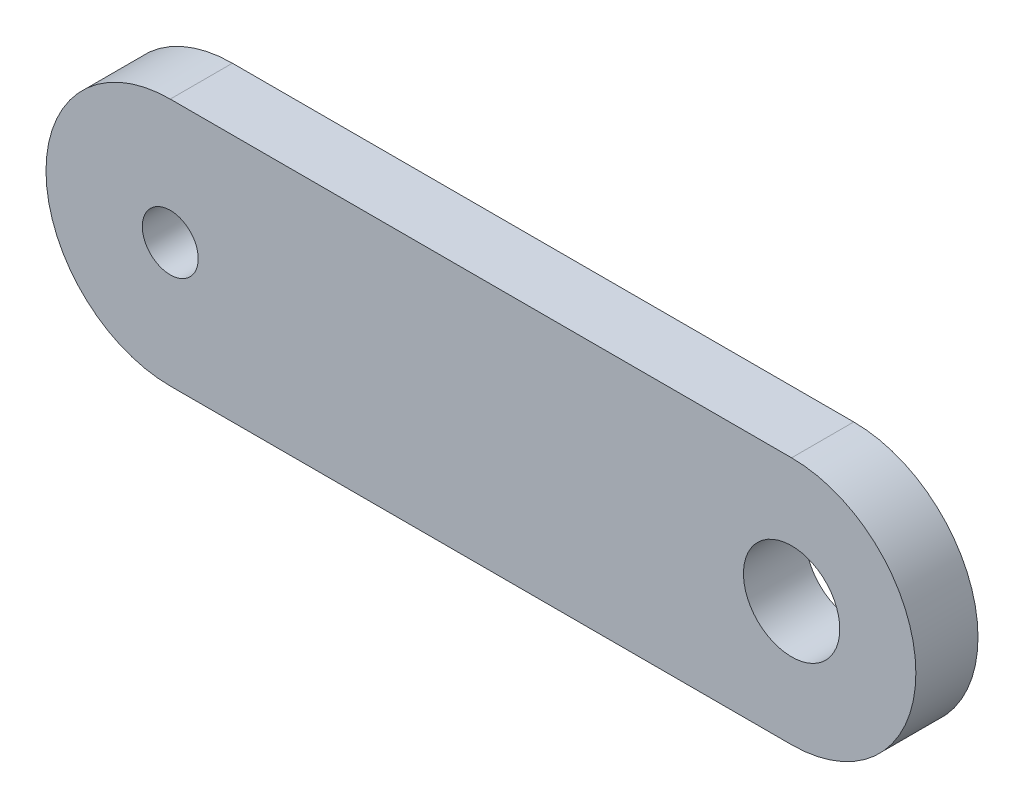
ISO-10303-21;
HEADER;
FILE_DESCRIPTION(('STEP AP214'),'2;1');
FILE_NAME('part.step','',(''),(''),'','','');
FILE_SCHEMA(('AUTOMOTIVE_DESIGN { 1 0 10303 214 1 1 1 1 }'));
ENDSEC;
DATA;
#1=APPLICATION_CONTEXT('core data for automotive mechanical design processes');
#2=APPLICATION_PROTOCOL_DEFINITION('international standard','automotive_design',2000,#1);
#3=PRODUCT_CONTEXT('',#1,'mechanical');
#4=PRODUCT('Part','Part','',(#3));
#5=PRODUCT_RELATED_PRODUCT_CATEGORY('part','',(#4));
#6=PRODUCT_DEFINITION_FORMATION('','',#4);
#7=PRODUCT_DEFINITION_CONTEXT('part definition',#1,'design');
#8=PRODUCT_DEFINITION('design','',#6,#7);
#9=PRODUCT_DEFINITION_SHAPE('','',#8);
#10=(LENGTH_UNIT() NAMED_UNIT(*) SI_UNIT(.MILLI.,.METRE.));
#11=(NAMED_UNIT(*) PLANE_ANGLE_UNIT() SI_UNIT($,.RADIAN.));
#12=(NAMED_UNIT(*) SI_UNIT($,.STERADIAN.) SOLID_ANGLE_UNIT());
#13=UNCERTAINTY_MEASURE_WITH_UNIT(LENGTH_MEASURE(1.E-05),#10,'distance_accuracy_value','');
#14=(GEOMETRIC_REPRESENTATION_CONTEXT(3) GLOBAL_UNCERTAINTY_ASSIGNED_CONTEXT((#13)) GLOBAL_UNIT_ASSIGNED_CONTEXT((#10,
#11,#12)) REPRESENTATION_CONTEXT('',''));
#15=CARTESIAN_POINT('',(0.,0.,0.));
#16=DIRECTION('',(0.,0.,1.));
#17=DIRECTION('',(1.,0.,0.));
#18=AXIS2_PLACEMENT_3D('',#15,#16,#17);
#19=CARTESIAN_POINT('',(10.,0.,2.));
#20=DIRECTION('',(0.,0.,1.));
#21=DIRECTION('',(1.,0.,0.));
#22=AXIS2_PLACEMENT_3D('',#19,#20,#21);
#23=PLANE('',#22);
#24=CARTESIAN_POINT('',(10.,0.,2.));
#25=DIRECTION('',(0.,0.,1.));
#26=DIRECTION('',(1.,0.,0.));
#27=AXIS2_PLACEMENT_3D('',#24,#25,#26);
#28=CIRCLE('',#27,1.55);
#29=CARTESIAN_POINT('',(11.55,0.,2.));
#30=VERTEX_POINT('',#29);
#31=EDGE_CURVE('E103',#30,#30,#28,.T.);
#32=ORIENTED_EDGE('',*,*,#31,.F.);
#33=EDGE_LOOP('',(#32));
#34=FACE_BOUND('',#33,.T.);
#35=CARTESIAN_POINT('',(10.,0.,2.));
#36=DIRECTION('',(0.,0.,1.));
#37=DIRECTION('',(1.,0.,0.));
#38=AXIS2_PLACEMENT_3D('',#35,#36,#37);
#39=CIRCLE('',#38,4.);
#40=CARTESIAN_POINT('',(10.,-4.,2.));
#41=VERTEX_POINT('',#40);
#42=CARTESIAN_POINT('',(10.,4.,2.));
#43=VERTEX_POINT('',#42);
#44=EDGE_CURVE('E88',#41,#43,#39,.T.);
#45=ORIENTED_EDGE('',*,*,#44,.T.);
#46=DIRECTION('',(-1.,0.,0.));
#47=VECTOR('',#46,1.);
#48=CARTESIAN_POINT('',(10.,4.,2.));
#49=LINE('',#48,#47);
#50=CARTESIAN_POINT('',(-10.,4.,2.));
#51=VERTEX_POINT('',#50);
#52=EDGE_CURVE('E83',#43,#51,#49,.T.);
#53=ORIENTED_EDGE('',*,*,#52,.T.);
#54=CARTESIAN_POINT('',(-10.,0.,2.));
#55=DIRECTION('',(0.,0.,1.));
#56=DIRECTION('',(1.,0.,0.));
#57=AXIS2_PLACEMENT_3D('',#54,#55,#56);
#58=CIRCLE('',#57,4.);
#59=CARTESIAN_POINT('',(-10.,-4.,2.));
#60=VERTEX_POINT('',#59);
#61=EDGE_CURVE('E86',#51,#60,#58,.T.);
#62=ORIENTED_EDGE('',*,*,#61,.T.);
#63=DIRECTION('',(1.,0.,0.));
#64=VECTOR('',#63,1.);
#65=CARTESIAN_POINT('',(10.,-4.,2.));
#66=LINE('',#65,#64);
#67=EDGE_CURVE('E53',#60,#41,#66,.T.);
#68=ORIENTED_EDGE('',*,*,#67,.T.);
#69=EDGE_LOOP('',(#45,#53,#62,#68));
#70=FACE_BOUND('',#69,.T.);
#71=CARTESIAN_POINT('',(-10.,0.,2.));
#72=DIRECTION('',(0.,0.,1.));
#73=DIRECTION('',(1.,0.,0.));
#74=AXIS2_PLACEMENT_3D('',#71,#72,#73);
#75=CIRCLE('',#74,0.9);
#76=CARTESIAN_POINT('',(-9.1,0.,2.));
#77=VERTEX_POINT('',#76);
#78=EDGE_CURVE('E118',#77,#77,#75,.T.);
#79=ORIENTED_EDGE('',*,*,#78,.F.);
#80=EDGE_LOOP('',(#79));
#81=FACE_BOUND('',#80,.T.);
#82=ADVANCED_FACE('F36',(#34,#70,#81),#23,.T.);
#83=CARTESIAN_POINT('',(10.,0.,0.));
#84=DIRECTION('',(0.,0.,1.));
#85=DIRECTION('',(1.,0.,0.));
#86=AXIS2_PLACEMENT_3D('',#83,#84,#85);
#87=PLANE('',#86);
#88=CARTESIAN_POINT('',(10.,0.,0.));
#89=DIRECTION('',(0.,0.,1.));
#90=DIRECTION('',(1.,0.,0.));
#91=AXIS2_PLACEMENT_3D('',#88,#89,#90);
#92=CIRCLE('',#91,4.);
#93=CARTESIAN_POINT('',(10.,-4.,0.));
#94=VERTEX_POINT('',#93);
#95=CARTESIAN_POINT('',(10.,4.,0.));
#96=VERTEX_POINT('',#95);
#97=EDGE_CURVE('E100',#94,#96,#92,.T.);
#98=ORIENTED_EDGE('',*,*,#97,.F.);
#99=DIRECTION('',(1.,0.,0.));
#100=VECTOR('',#99,1.);
#101=CARTESIAN_POINT('',(10.,-4.,0.));
#102=LINE('',#101,#100);
#103=CARTESIAN_POINT('',(-10.,-4.,0.));
#104=VERTEX_POINT('',#103);
#105=EDGE_CURVE('E76',#104,#94,#102,.T.);
#106=ORIENTED_EDGE('',*,*,#105,.F.);
#107=CARTESIAN_POINT('',(-10.,0.,0.));
#108=DIRECTION('',(0.,0.,1.));
#109=DIRECTION('',(1.,0.,0.));
#110=AXIS2_PLACEMENT_3D('',#107,#108,#109);
#111=CIRCLE('',#110,4.);
#112=CARTESIAN_POINT('',(-10.,4.,0.));
#113=VERTEX_POINT('',#112);
#114=EDGE_CURVE('E70',#113,#104,#111,.T.);
#115=ORIENTED_EDGE('',*,*,#114,.F.);
#116=DIRECTION('',(-1.,0.,0.));
#117=VECTOR('',#116,1.);
#118=CARTESIAN_POINT('',(10.,4.,0.));
#119=LINE('',#118,#117);
#120=EDGE_CURVE('E92',#96,#113,#119,.T.);
#121=ORIENTED_EDGE('',*,*,#120,.F.);
#122=EDGE_LOOP('',(#98,#106,#115,#121));
#123=FACE_BOUND('',#122,.T.);
#124=CARTESIAN_POINT('',(10.,0.,0.));
#125=DIRECTION('',(0.,0.,1.));
#126=DIRECTION('',(1.,0.,0.));
#127=AXIS2_PLACEMENT_3D('',#124,#125,#126);
#128=CIRCLE('',#127,1.55);
#129=CARTESIAN_POINT('',(11.55,0.,0.));
#130=VERTEX_POINT('',#129);
#131=EDGE_CURVE('E115',#130,#130,#128,.T.);
#132=ORIENTED_EDGE('',*,*,#131,.T.);
#133=EDGE_LOOP('',(#132));
#134=FACE_BOUND('',#133,.T.);
#135=CARTESIAN_POINT('',(-10.,0.,0.));
#136=DIRECTION('',(0.,0.,1.));
#137=DIRECTION('',(1.,0.,0.));
#138=AXIS2_PLACEMENT_3D('',#135,#136,#137);
#139=CIRCLE('',#138,0.9);
#140=CARTESIAN_POINT('',(-9.1,0.,0.));
#141=VERTEX_POINT('',#140);
#142=EDGE_CURVE('E121',#141,#141,#139,.T.);
#143=ORIENTED_EDGE('',*,*,#142,.T.);
#144=EDGE_LOOP('',(#143));
#145=FACE_BOUND('',#144,.T.);
#146=ADVANCED_FACE('F111',(#123,#134,#145),#87,.F.);
#147=CARTESIAN_POINT('',(10.,0.,2.));
#148=DIRECTION('',(0.,0.,-1.));
#149=DIRECTION('',(-1.,0.,0.));
#150=AXIS2_PLACEMENT_3D('',#147,#148,#149);
#151=CYLINDRICAL_SURFACE('',#150,4.);
#152=ORIENTED_EDGE('',*,*,#97,.T.);
#153=DIRECTION('',(0.,0.,-1.));
#154=VECTOR('',#153,1.);
#155=CARTESIAN_POINT('',(10.,4.,2.));
#156=LINE('',#155,#154);
#157=EDGE_CURVE('E11',#43,#96,#156,.T.);
#158=ORIENTED_EDGE('',*,*,#157,.F.);
#159=ORIENTED_EDGE('',*,*,#44,.F.);
#160=DIRECTION('',(0.,0.,-1.));
#161=VECTOR('',#160,1.);
#162=CARTESIAN_POINT('',(10.,-4.,2.));
#163=LINE('',#162,#161);
#164=EDGE_CURVE('E96',#41,#94,#163,.T.);
#165=ORIENTED_EDGE('',*,*,#164,.T.);
#166=EDGE_LOOP('',(#152,#158,#159,#165));
#167=FACE_BOUND('',#166,.T.);
#168=ADVANCED_FACE('F38',(#167),#151,.T.);
#169=CARTESIAN_POINT('',(10.,4.,2.));
#170=DIRECTION('',(0.,-1.,0.));
#171=DIRECTION('',(1.,0.,0.));
#172=AXIS2_PLACEMENT_3D('',#169,#170,#171);
#173=PLANE('',#172);
#174=ORIENTED_EDGE('',*,*,#120,.T.);
#175=DIRECTION('',(0.,0.,-1.));
#176=VECTOR('',#175,1.);
#177=CARTESIAN_POINT('',(-10.,4.,2.));
#178=LINE('',#177,#176);
#179=EDGE_CURVE('E45',#51,#113,#178,.T.);
#180=ORIENTED_EDGE('',*,*,#179,.F.);
#181=ORIENTED_EDGE('',*,*,#52,.F.);
#182=ORIENTED_EDGE('',*,*,#157,.T.);
#183=EDGE_LOOP('',(#174,#180,#181,#182));
#184=FACE_BOUND('',#183,.T.);
#185=ADVANCED_FACE('F91',(#184),#173,.F.);
#186=CARTESIAN_POINT('',(-10.,0.,2.));
#187=DIRECTION('',(0.,0.,-1.));
#188=DIRECTION('',(-1.,0.,0.));
#189=AXIS2_PLACEMENT_3D('',#186,#187,#188);
#190=CYLINDRICAL_SURFACE('',#189,4.);
#191=ORIENTED_EDGE('',*,*,#114,.T.);
#192=DIRECTION('',(0.,0.,-1.));
#193=VECTOR('',#192,1.);
#194=CARTESIAN_POINT('',(-10.,-4.,2.));
#195=LINE('',#194,#193);
#196=EDGE_CURVE('E93',#60,#104,#195,.T.);
#197=ORIENTED_EDGE('',*,*,#196,.F.);
#198=ORIENTED_EDGE('',*,*,#61,.F.);
#199=ORIENTED_EDGE('',*,*,#179,.T.);
#200=EDGE_LOOP('',(#191,#197,#198,#199));
#201=FACE_BOUND('',#200,.T.);
#202=ADVANCED_FACE('F94',(#201),#190,.T.);
#203=CARTESIAN_POINT('',(10.,-4.,2.));
#204=DIRECTION('',(0.,1.,0.));
#205=DIRECTION('',(-1.,0.,0.));
#206=AXIS2_PLACEMENT_3D('',#203,#204,#205);
#207=PLANE('',#206);
#208=ORIENTED_EDGE('',*,*,#105,.T.);
#209=ORIENTED_EDGE('',*,*,#164,.F.);
#210=ORIENTED_EDGE('',*,*,#67,.F.);
#211=ORIENTED_EDGE('',*,*,#196,.T.);
#212=EDGE_LOOP('',(#208,#209,#210,#211));
#213=FACE_BOUND('',#212,.T.);
#214=ADVANCED_FACE('F108',(#213),#207,.F.);
#215=CARTESIAN_POINT('',(10.,0.,2.));
#216=DIRECTION('',(0.,0.,-1.));
#217=DIRECTION('',(-1.,0.,0.));
#218=AXIS2_PLACEMENT_3D('',#215,#216,#217);
#219=CYLINDRICAL_SURFACE('',#218,1.55);
#220=ORIENTED_EDGE('',*,*,#31,.T.);
#221=EDGE_LOOP('',(#220));
#222=FACE_BOUND('',#221,.T.);
#223=ORIENTED_EDGE('',*,*,#131,.F.);
#224=EDGE_LOOP('',(#223));
#225=FACE_BOUND('',#224,.T.);
#226=ADVANCED_FACE('F138',(#222,#225),#219,.F.);
#227=CARTESIAN_POINT('',(-10.,0.,2.));
#228=DIRECTION('',(0.,0.,-1.));
#229=DIRECTION('',(-1.,0.,0.));
#230=AXIS2_PLACEMENT_3D('',#227,#228,#229);
#231=CYLINDRICAL_SURFACE('',#230,0.9);
#232=ORIENTED_EDGE('',*,*,#78,.T.);
#233=EDGE_LOOP('',(#232));
#234=FACE_BOUND('',#233,.T.);
#235=ORIENTED_EDGE('',*,*,#142,.F.);
#236=EDGE_LOOP('',(#235));
#237=FACE_BOUND('',#236,.T.);
#238=ADVANCED_FACE('F127',(#234,#237),#231,.F.);
#239=CLOSED_SHELL('',(#82,#146,#168,#185,#202,#214,#226,#238));
#240=MANIFOLD_SOLID_BREP('B2',#239);
#241=ADVANCED_BREP_SHAPE_REPRESENTATION('',(#18,#240),#14);
#242=SHAPE_DEFINITION_REPRESENTATION(#9,#241);
ENDSEC;
END-ISO-10303-21;
